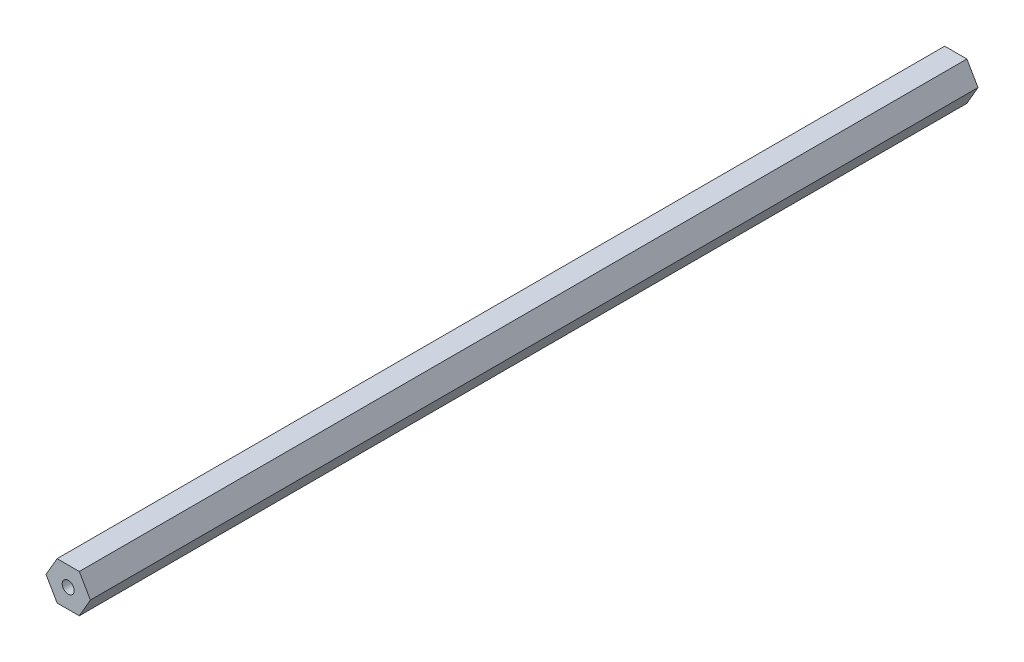
ISO-10303-21;
HEADER;
FILE_DESCRIPTION(('STEP AP214'),'2;1');
FILE_NAME('part.step','',(''),(''),'','','');
FILE_SCHEMA(('AUTOMOTIVE_DESIGN { 1 0 10303 214 1 1 1 1 }'));
ENDSEC;
DATA;
#1=APPLICATION_CONTEXT('core data for automotive mechanical design processes');
#2=APPLICATION_PROTOCOL_DEFINITION('international standard','automotive_design',2000,#1);
#3=PRODUCT_CONTEXT('',#1,'mechanical');
#4=PRODUCT('Part','Part','',(#3));
#5=PRODUCT_RELATED_PRODUCT_CATEGORY('part','',(#4));
#6=PRODUCT_DEFINITION_FORMATION('','',#4);
#7=PRODUCT_DEFINITION_CONTEXT('part definition',#1,'design');
#8=PRODUCT_DEFINITION('design','',#6,#7);
#9=PRODUCT_DEFINITION_SHAPE('','',#8);
#10=(LENGTH_UNIT() NAMED_UNIT(*) SI_UNIT(.MILLI.,.METRE.));
#11=(NAMED_UNIT(*) PLANE_ANGLE_UNIT() SI_UNIT($,.RADIAN.));
#12=(NAMED_UNIT(*) SI_UNIT($,.STERADIAN.) SOLID_ANGLE_UNIT());
#13=UNCERTAINTY_MEASURE_WITH_UNIT(LENGTH_MEASURE(1.E-05),#10,'distance_accuracy_value','');
#14=(GEOMETRIC_REPRESENTATION_CONTEXT(3) GLOBAL_UNCERTAINTY_ASSIGNED_CONTEXT((#13)) GLOBAL_UNIT_ASSIGNED_CONTEXT((#10,
#11,#12)) REPRESENTATION_CONTEXT('',''));
#15=CARTESIAN_POINT('',(0.,0.,0.));
#16=DIRECTION('',(0.,0.,1.));
#17=DIRECTION('',(1.,0.,0.));
#18=AXIS2_PLACEMENT_3D('',#15,#16,#17);
#19=CARTESIAN_POINT('',(0.,0.,127.));
#20=DIRECTION('',(0.,0.,1.));
#21=DIRECTION('',(1.,0.,0.));
#22=AXIS2_PLACEMENT_3D('',#19,#20,#21);
#23=PLANE('',#22);
#24=DIRECTION('',(0.5,0.866025403784439,0.));
#25=VECTOR('',#24,1.);
#26=CARTESIAN_POINT('',(3.175,-5.49926131403119,127.));
#27=LINE('',#26,#25);
#28=CARTESIAN_POINT('',(3.175,-5.49926131403119,127.));
#29=VERTEX_POINT('',#28);
#30=CARTESIAN_POINT('',(6.35,0.,127.));
#31=VERTEX_POINT('',#30);
#32=EDGE_CURVE('E152',#29,#31,#27,.T.);
#33=ORIENTED_EDGE('',*,*,#32,.T.);
#34=DIRECTION('',(-0.5,0.866025403784439,0.));
#35=VECTOR('',#34,1.);
#36=CARTESIAN_POINT('',(6.35,0.,127.));
#37=LINE('',#36,#35);
#38=CARTESIAN_POINT('',(3.175,5.49926131403119,127.));
#39=VERTEX_POINT('',#38);
#40=EDGE_CURVE('E100',#31,#39,#37,.T.);
#41=ORIENTED_EDGE('',*,*,#40,.T.);
#42=DIRECTION('',(-1.,0.,0.));
#43=VECTOR('',#42,1.);
#44=CARTESIAN_POINT('',(3.175,5.49926131403119,127.));
#45=LINE('',#44,#43);
#46=CARTESIAN_POINT('',(-3.175,5.49926131403119,127.));
#47=VERTEX_POINT('',#46);
#48=EDGE_CURVE('E113',#39,#47,#45,.T.);
#49=ORIENTED_EDGE('',*,*,#48,.T.);
#50=DIRECTION('',(-0.5,-0.866025403784438,0.));
#51=VECTOR('',#50,1.);
#52=CARTESIAN_POINT('',(-3.175,5.49926131403119,127.));
#53=LINE('',#52,#51);
#54=CARTESIAN_POINT('',(-6.35,0.,127.));
#55=VERTEX_POINT('',#54);
#56=EDGE_CURVE('E107',#47,#55,#53,.T.);
#57=ORIENTED_EDGE('',*,*,#56,.T.);
#58=DIRECTION('',(0.5,-0.866025403784439,0.));
#59=VECTOR('',#58,1.);
#60=CARTESIAN_POINT('',(-6.35,0.,127.));
#61=LINE('',#60,#59);
#62=CARTESIAN_POINT('',(-3.175,-5.49926131403119,127.));
#63=VERTEX_POINT('',#62);
#64=EDGE_CURVE('E111',#55,#63,#61,.T.);
#65=ORIENTED_EDGE('',*,*,#64,.T.);
#66=DIRECTION('',(1.,0.,0.));
#67=VECTOR('',#66,1.);
#68=CARTESIAN_POINT('',(-3.175,-5.49926131403119,127.));
#69=LINE('',#68,#67);
#70=EDGE_CURVE('E63',#63,#29,#69,.T.);
#71=ORIENTED_EDGE('',*,*,#70,.T.);
#72=EDGE_LOOP('',(#33,#41,#49,#57,#65,#71));
#73=FACE_BOUND('',#72,.T.);
#74=CARTESIAN_POINT('',(0.,0.,127.));
#75=DIRECTION('',(0.,0.,1.));
#76=DIRECTION('',(1.,0.,0.));
#77=AXIS2_PLACEMENT_3D('',#74,#75,#76);
#78=CIRCLE('',#77,1.7145);
#79=CARTESIAN_POINT('',(1.7145,0.,127.));
#80=VERTEX_POINT('',#79);
#81=EDGE_CURVE('E140',#80,#80,#78,.T.);
#82=ORIENTED_EDGE('',*,*,#81,.F.);
#83=EDGE_LOOP('',(#82));
#84=FACE_BOUND('',#83,.T.);
#85=ADVANCED_FACE('F45',(#73,#84),#23,.T.);
#86=CARTESIAN_POINT('',(0.,0.,-127.));
#87=DIRECTION('',(0.,0.,1.));
#88=DIRECTION('',(1.,0.,0.));
#89=AXIS2_PLACEMENT_3D('',#86,#87,#88);
#90=PLANE('',#89);
#91=DIRECTION('',(0.5,0.866025403784439,0.));
#92=VECTOR('',#91,1.);
#93=CARTESIAN_POINT('',(3.175,-5.49926131403119,-127.));
#94=LINE('',#93,#92);
#95=CARTESIAN_POINT('',(3.175,-5.49926131403119,-127.));
#96=VERTEX_POINT('',#95);
#97=CARTESIAN_POINT('',(6.35,0.,-127.));
#98=VERTEX_POINT('',#97);
#99=EDGE_CURVE('E135',#96,#98,#94,.T.);
#100=ORIENTED_EDGE('',*,*,#99,.F.);
#101=DIRECTION('',(1.,0.,0.));
#102=VECTOR('',#101,1.);
#103=CARTESIAN_POINT('',(-3.175,-5.49926131403119,-127.));
#104=LINE('',#103,#102);
#105=CARTESIAN_POINT('',(-3.175,-5.49926131403119,-127.));
#106=VERTEX_POINT('',#105);
#107=EDGE_CURVE('E92',#106,#96,#104,.T.);
#108=ORIENTED_EDGE('',*,*,#107,.F.);
#109=DIRECTION('',(0.5,-0.866025403784439,0.));
#110=VECTOR('',#109,1.);
#111=CARTESIAN_POINT('',(-6.35,0.,-127.));
#112=LINE('',#111,#110);
#113=CARTESIAN_POINT('',(-6.35,0.,-127.));
#114=VERTEX_POINT('',#113);
#115=EDGE_CURVE('E86',#114,#106,#112,.T.);
#116=ORIENTED_EDGE('',*,*,#115,.F.);
#117=DIRECTION('',(-0.5,-0.866025403784438,0.));
#118=VECTOR('',#117,1.);
#119=CARTESIAN_POINT('',(-3.175,5.49926131403119,-127.));
#120=LINE('',#119,#118);
#121=CARTESIAN_POINT('',(-3.175,5.49926131403119,-127.));
#122=VERTEX_POINT('',#121);
#123=EDGE_CURVE('E122',#122,#114,#120,.T.);
#124=ORIENTED_EDGE('',*,*,#123,.F.);
#125=DIRECTION('',(-1.,0.,0.));
#126=VECTOR('',#125,1.);
#127=CARTESIAN_POINT('',(3.175,5.49926131403119,-127.));
#128=LINE('',#127,#126);
#129=CARTESIAN_POINT('',(3.175,5.49926131403119,-127.));
#130=VERTEX_POINT('',#129);
#131=EDGE_CURVE('E143',#130,#122,#128,.T.);
#132=ORIENTED_EDGE('',*,*,#131,.F.);
#133=DIRECTION('',(-0.5,0.866025403784439,0.));
#134=VECTOR('',#133,1.);
#135=CARTESIAN_POINT('',(6.35,0.,-127.));
#136=LINE('',#135,#134);
#137=EDGE_CURVE('E139',#98,#130,#136,.T.);
#138=ORIENTED_EDGE('',*,*,#137,.F.);
#139=EDGE_LOOP('',(#100,#108,#116,#124,#132,#138));
#140=FACE_BOUND('',#139,.T.);
#141=CARTESIAN_POINT('',(0.,0.,-127.));
#142=DIRECTION('',(0.,0.,1.));
#143=DIRECTION('',(1.,0.,0.));
#144=AXIS2_PLACEMENT_3D('',#141,#142,#143);
#145=CIRCLE('',#144,1.7145);
#146=CARTESIAN_POINT('',(1.7145,0.,-127.));
#147=VERTEX_POINT('',#146);
#148=EDGE_CURVE('E249',#147,#147,#145,.T.);
#149=ORIENTED_EDGE('',*,*,#148,.T.);
#150=EDGE_LOOP('',(#149));
#151=FACE_BOUND('',#150,.T.);
#152=ADVANCED_FACE('F165',(#140,#151),#90,.F.);
#153=CARTESIAN_POINT('',(3.175,-5.49926131403119,127.));
#154=DIRECTION('',(-0.866025403784439,0.5,0.));
#155=DIRECTION('',(-0.5,-0.866025403784439,0.));
#156=AXIS2_PLACEMENT_3D('',#153,#154,#155);
#157=PLANE('',#156);
#158=ORIENTED_EDGE('',*,*,#99,.T.);
#159=DIRECTION('',(0.,0.,-1.));
#160=VECTOR('',#159,1.);
#161=CARTESIAN_POINT('',(6.35,0.,127.));
#162=LINE('',#161,#160);
#163=EDGE_CURVE('E11',#31,#98,#162,.T.);
#164=ORIENTED_EDGE('',*,*,#163,.F.);
#165=ORIENTED_EDGE('',*,*,#32,.F.);
#166=DIRECTION('',(0.,0.,-1.));
#167=VECTOR('',#166,1.);
#168=CARTESIAN_POINT('',(3.175,-5.49926131403119,127.));
#169=LINE('',#168,#167);
#170=EDGE_CURVE('E131',#29,#96,#169,.T.);
#171=ORIENTED_EDGE('',*,*,#170,.T.);
#172=EDGE_LOOP('',(#158,#164,#165,#171));
#173=FACE_BOUND('',#172,.T.);
#174=ADVANCED_FACE('F47',(#173),#157,.F.);
#175=CARTESIAN_POINT('',(6.35,0.,127.));
#176=DIRECTION('',(-0.866025403784439,-0.5,0.));
#177=DIRECTION('',(0.5,-0.866025403784439,0.));
#178=AXIS2_PLACEMENT_3D('',#175,#176,#177);
#179=PLANE('',#178);
#180=ORIENTED_EDGE('',*,*,#137,.T.);
#181=DIRECTION('',(0.,0.,-1.));
#182=VECTOR('',#181,1.);
#183=CARTESIAN_POINT('',(3.175,5.49926131403119,127.));
#184=LINE('',#183,#182);
#185=EDGE_CURVE('E55',#39,#130,#184,.T.);
#186=ORIENTED_EDGE('',*,*,#185,.F.);
#187=ORIENTED_EDGE('',*,*,#40,.F.);
#188=ORIENTED_EDGE('',*,*,#163,.T.);
#189=EDGE_LOOP('',(#180,#186,#187,#188));
#190=FACE_BOUND('',#189,.T.);
#191=ADVANCED_FACE('F190',(#190),#179,.F.);
#192=CARTESIAN_POINT('',(3.175,5.49926131403119,127.));
#193=DIRECTION('',(0.,-1.,0.));
#194=DIRECTION('',(1.,0.,0.));
#195=AXIS2_PLACEMENT_3D('',#192,#193,#194);
#196=PLANE('',#195);
#197=ORIENTED_EDGE('',*,*,#131,.T.);
#198=DIRECTION('',(0.,0.,-1.));
#199=VECTOR('',#198,1.);
#200=CARTESIAN_POINT('',(-3.175,5.49926131403119,127.));
#201=LINE('',#200,#199);
#202=EDGE_CURVE('E124',#47,#122,#201,.T.);
#203=ORIENTED_EDGE('',*,*,#202,.F.);
#204=ORIENTED_EDGE('',*,*,#48,.F.);
#205=ORIENTED_EDGE('',*,*,#185,.T.);
#206=EDGE_LOOP('',(#197,#203,#204,#205));
#207=FACE_BOUND('',#206,.T.);
#208=ADVANCED_FACE('F162',(#207),#196,.F.);
#209=CARTESIAN_POINT('',(-3.175,5.49926131403119,127.));
#210=DIRECTION('',(0.866025403784438,-0.5,0.));
#211=DIRECTION('',(0.5,0.866025403784439,0.));
#212=AXIS2_PLACEMENT_3D('',#209,#210,#211);
#213=PLANE('',#212);
#214=ORIENTED_EDGE('',*,*,#123,.T.);
#215=DIRECTION('',(0.,0.,-1.));
#216=VECTOR('',#215,1.);
#217=CARTESIAN_POINT('',(-6.35,0.,127.));
#218=LINE('',#217,#216);
#219=EDGE_CURVE('E119',#55,#114,#218,.T.);
#220=ORIENTED_EDGE('',*,*,#219,.F.);
#221=ORIENTED_EDGE('',*,*,#56,.F.);
#222=ORIENTED_EDGE('',*,*,#202,.T.);
#223=EDGE_LOOP('',(#214,#220,#221,#222));
#224=FACE_BOUND('',#223,.T.);
#225=ADVANCED_FACE('F120',(#224),#213,.F.);
#226=CARTESIAN_POINT('',(-6.35,0.,127.));
#227=DIRECTION('',(0.866025403784439,0.5,0.));
#228=DIRECTION('',(-0.5,0.866025403784439,0.));
#229=AXIS2_PLACEMENT_3D('',#226,#227,#228);
#230=PLANE('',#229);
#231=ORIENTED_EDGE('',*,*,#115,.T.);
#232=DIRECTION('',(0.,0.,-1.));
#233=VECTOR('',#232,1.);
#234=CARTESIAN_POINT('',(-3.175,-5.49926131403119,127.));
#235=LINE('',#234,#233);
#236=EDGE_CURVE('E125',#63,#106,#235,.T.);
#237=ORIENTED_EDGE('',*,*,#236,.F.);
#238=ORIENTED_EDGE('',*,*,#64,.F.);
#239=ORIENTED_EDGE('',*,*,#219,.T.);
#240=EDGE_LOOP('',(#231,#237,#238,#239));
#241=FACE_BOUND('',#240,.T.);
#242=ADVANCED_FACE('F127',(#241),#230,.F.);
#243=CARTESIAN_POINT('',(-3.175,-5.49926131403119,127.));
#244=DIRECTION('',(0.,1.,0.));
#245=DIRECTION('',(0.,0.,1.));
#246=AXIS2_PLACEMENT_3D('',#243,#244,#245);
#247=PLANE('',#246);
#248=ORIENTED_EDGE('',*,*,#107,.T.);
#249=ORIENTED_EDGE('',*,*,#170,.F.);
#250=ORIENTED_EDGE('',*,*,#70,.F.);
#251=ORIENTED_EDGE('',*,*,#236,.T.);
#252=EDGE_LOOP('',(#248,#249,#250,#251));
#253=FACE_BOUND('',#252,.T.);
#254=ADVANCED_FACE('F170',(#253),#247,.F.);
#255=CARTESIAN_POINT('',(0.,0.,127.));
#256=DIRECTION('',(0.,0.,-1.));
#257=DIRECTION('',(-1.,0.,0.));
#258=AXIS2_PLACEMENT_3D('',#255,#256,#257);
#259=CYLINDRICAL_SURFACE('',#258,1.7145);
#260=ORIENTED_EDGE('',*,*,#81,.T.);
#261=EDGE_LOOP('',(#260));
#262=FACE_BOUND('',#261,.T.);
#263=ORIENTED_EDGE('',*,*,#148,.F.);
#264=EDGE_LOOP('',(#263));
#265=FACE_BOUND('',#264,.T.);
#266=ADVANCED_FACE('F172',(#262,#265),#259,.F.);
#267=CLOSED_SHELL('',(#85,#152,#174,#191,#208,#225,#242,#254,#266));
#268=MANIFOLD_SOLID_BREP('B2',#267);
#269=ADVANCED_BREP_SHAPE_REPRESENTATION('',(#18,#268),#14);
#270=SHAPE_DEFINITION_REPRESENTATION(#9,#269);
ENDSEC;
END-ISO-10303-21;
